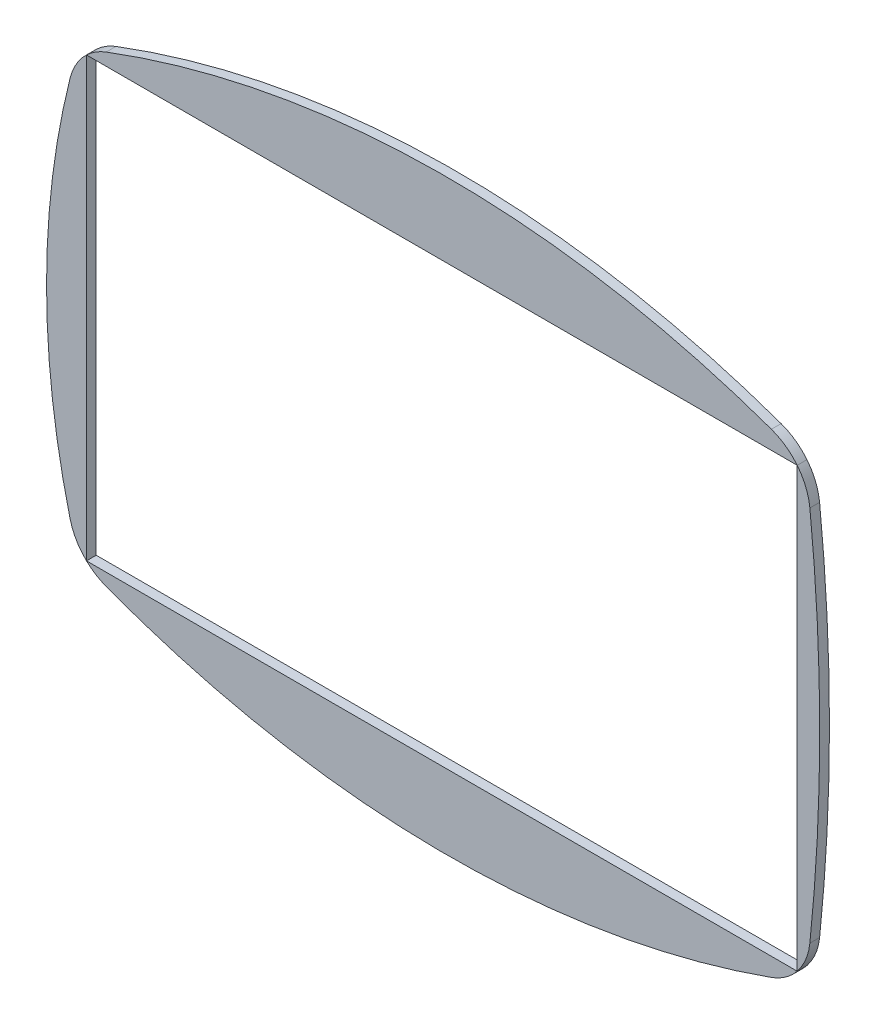
ISO-10303-21;
HEADER;
FILE_DESCRIPTION(('STEP AP214'),'2;1');
FILE_NAME('part.step','',(''),(''),'','','');
FILE_SCHEMA(('AUTOMOTIVE_DESIGN { 1 0 10303 214 1 1 1 1 }'));
ENDSEC;
DATA;
#1=APPLICATION_CONTEXT('core data for automotive mechanical design processes');
#2=APPLICATION_PROTOCOL_DEFINITION('international standard','automotive_design',2000,#1);
#3=PRODUCT_CONTEXT('',#1,'mechanical');
#4=PRODUCT('Part','Part','',(#3));
#5=PRODUCT_RELATED_PRODUCT_CATEGORY('part','',(#4));
#6=PRODUCT_DEFINITION_FORMATION('','',#4);
#7=PRODUCT_DEFINITION_CONTEXT('part definition',#1,'design');
#8=PRODUCT_DEFINITION('design','',#6,#7);
#9=PRODUCT_DEFINITION_SHAPE('','',#8);
#10=(LENGTH_UNIT() NAMED_UNIT(*) SI_UNIT(.MILLI.,.METRE.));
#11=(NAMED_UNIT(*) PLANE_ANGLE_UNIT() SI_UNIT($,.RADIAN.));
#12=(NAMED_UNIT(*) SI_UNIT($,.STERADIAN.) SOLID_ANGLE_UNIT());
#13=UNCERTAINTY_MEASURE_WITH_UNIT(LENGTH_MEASURE(1.E-05),#10,'distance_accuracy_value','');
#14=(GEOMETRIC_REPRESENTATION_CONTEXT(3) GLOBAL_UNCERTAINTY_ASSIGNED_CONTEXT((#13)) GLOBAL_UNIT_ASSIGNED_CONTEXT((#10,
#11,#12)) REPRESENTATION_CONTEXT('',''));
#15=CARTESIAN_POINT('',(0.,0.,0.));
#16=DIRECTION('',(0.,0.,1.));
#17=DIRECTION('',(1.,0.,0.));
#18=AXIS2_PLACEMENT_3D('',#15,#16,#17);
#19=CARTESIAN_POINT('',(-547.210393977895,62.5000000000001,-3.));
#20=DIRECTION('',(0.,0.,1.));
#21=DIRECTION('',(1.,0.,0.));
#22=AXIS2_PLACEMENT_3D('',#19,#20,#21);
#23=CYLINDRICAL_SURFACE('',#22,557.141534113717);
#24=CARTESIAN_POINT('',(-547.210393977895,62.5000000000001,0.));
#25=DIRECTION('',(0.,0.,1.));
#26=DIRECTION('',(1.,0.,0.));
#27=AXIS2_PLACEMENT_3D('',#24,#25,#26);
#28=CIRCLE('',#27,557.141534113717);
#29=CARTESIAN_POINT('',(6.89672289605585,4.43114376687543,0.));
#30=VERTEX_POINT('',#29);
#31=CARTESIAN_POINT('',(6.89672289605581,120.568856233125,0.));
#32=VERTEX_POINT('',#31);
#33=EDGE_CURVE('E110',#30,#32,#28,.T.);
#34=ORIENTED_EDGE('',*,*,#33,.F.);
#35=DIRECTION('',(0.,0.,1.));
#36=VECTOR('',#35,1.);
#37=CARTESIAN_POINT('',(6.89672289605585,4.43114376687543,-3.));
#38=LINE('',#37,#36);
#39=CARTESIAN_POINT('',(6.89672289605585,4.43114376687543,-3.));
#40=VERTEX_POINT('',#39);
#41=EDGE_CURVE('E12',#40,#30,#38,.T.);
#42=ORIENTED_EDGE('',*,*,#41,.F.);
#43=CARTESIAN_POINT('',(-547.210393977895,62.5000000000001,-3.));
#44=DIRECTION('',(0.,0.,1.));
#45=DIRECTION('',(1.,0.,0.));
#46=AXIS2_PLACEMENT_3D('',#43,#44,#45);
#47=CIRCLE('',#46,557.141534113717);
#48=CARTESIAN_POINT('',(6.89672289605581,120.568856233125,-3.));
#49=VERTEX_POINT('',#48);
#50=EDGE_CURVE('E104',#40,#49,#47,.T.);
#51=ORIENTED_EDGE('',*,*,#50,.T.);
#52=DIRECTION('',(0.,0.,1.));
#53=VECTOR('',#52,1.);
#54=CARTESIAN_POINT('',(6.89672289605581,120.568856233125,-3.));
#55=LINE('',#54,#53);
#56=EDGE_CURVE('E49',#49,#32,#55,.T.);
#57=ORIENTED_EDGE('',*,*,#56,.T.);
#58=EDGE_LOOP('',(#34,#42,#51,#57));
#59=FACE_BOUND('',#58,.T.);
#60=ADVANCED_FACE('F46',(#59),#23,.T.);
#61=CARTESIAN_POINT('',(-11.0052418526276,6.30721896177,-3.));
#62=DIRECTION('',(0.,0.,1.));
#63=DIRECTION('',(1.,0.,0.));
#64=AXIS2_PLACEMENT_3D('',#61,#62,#63);
#65=CYLINDRICAL_SURFACE('',#64,18.0000000000001);
#66=CARTESIAN_POINT('',(-11.0052418526276,6.30721896177,0.));
#67=DIRECTION('',(0.,0.,1.));
#68=DIRECTION('',(1.,0.,0.));
#69=AXIS2_PLACEMENT_3D('',#66,#67,#68);
#70=CIRCLE('',#69,18.0000000000001);
#71=CARTESIAN_POINT('',(2.99999999999996,-4.99999999999997,0.));
#72=VERTEX_POINT('',#71);
#73=EDGE_CURVE('E106',#72,#30,#70,.T.);
#74=ORIENTED_EDGE('',*,*,#73,.F.);
#75=DIRECTION('',(0.,0.,1.));
#76=VECTOR('',#75,1.);
#77=CARTESIAN_POINT('',(2.99999999999996,-4.99999999999997,-3.));
#78=LINE('',#77,#76);
#79=CARTESIAN_POINT('',(2.99999999999996,-4.99999999999997,-3.));
#80=VERTEX_POINT('',#79);
#81=EDGE_CURVE('E55',#80,#72,#78,.T.);
#82=ORIENTED_EDGE('',*,*,#81,.F.);
#83=CARTESIAN_POINT('',(-11.0052418526276,6.30721896177,-3.));
#84=DIRECTION('',(0.,0.,1.));
#85=DIRECTION('',(1.,0.,0.));
#86=AXIS2_PLACEMENT_3D('',#83,#84,#85);
#87=CIRCLE('',#86,18.0000000000001);
#88=EDGE_CURVE('E94',#80,#40,#87,.T.);
#89=ORIENTED_EDGE('',*,*,#88,.T.);
#90=ORIENTED_EDGE('',*,*,#41,.T.);
#91=EDGE_LOOP('',(#74,#82,#89,#90));
#92=FACE_BOUND('',#91,.T.);
#93=ADVANCED_FACE('F120',(#92),#65,.T.);
#94=CARTESIAN_POINT('',(2.99999999999996,0.,-3.));
#95=DIRECTION('',(1.,0.,0.));
#96=DIRECTION('',(0.,1.,0.));
#97=AXIS2_PLACEMENT_3D('',#94,#95,#96);
#98=PLANE('',#97);
#99=DIRECTION('',(0.,1.,0.));
#100=VECTOR('',#99,1.);
#101=CARTESIAN_POINT('',(2.99999999999996,0.,0.));
#102=LINE('',#101,#100);
#103=CARTESIAN_POINT('',(2.99999999999998,130.,0.));
#104=VERTEX_POINT('',#103);
#105=EDGE_CURVE('E99',#72,#104,#102,.T.);
#106=ORIENTED_EDGE('',*,*,#105,.T.);
#107=DIRECTION('',(0.,0.,1.));
#108=VECTOR('',#107,1.);
#109=CARTESIAN_POINT('',(2.99999999999998,130.,-3.));
#110=LINE('',#109,#108);
#111=CARTESIAN_POINT('',(2.99999999999998,130.,-3.));
#112=VERTEX_POINT('',#111);
#113=EDGE_CURVE('E97',#112,#104,#110,.T.);
#114=ORIENTED_EDGE('',*,*,#113,.F.);
#115=DIRECTION('',(0.,1.,0.));
#116=VECTOR('',#115,1.);
#117=CARTESIAN_POINT('',(2.99999999999996,0.,-3.));
#118=LINE('',#117,#116);
#119=EDGE_CURVE('E91',#80,#112,#118,.T.);
#120=ORIENTED_EDGE('',*,*,#119,.F.);
#121=ORIENTED_EDGE('',*,*,#81,.T.);
#122=EDGE_LOOP('',(#106,#114,#120,#121));
#123=FACE_BOUND('',#122,.T.);
#124=ADVANCED_FACE('F98',(#123),#98,.F.);
#125=CARTESIAN_POINT('',(-11.0052418526276,118.69278103823,-3.));
#126=DIRECTION('',(0.,0.,1.));
#127=DIRECTION('',(1.,0.,0.));
#128=AXIS2_PLACEMENT_3D('',#125,#126,#127);
#129=CYLINDRICAL_SURFACE('',#128,18.0000000000001);
#130=CARTESIAN_POINT('',(-11.0052418526276,118.69278103823,0.));
#131=DIRECTION('',(0.,0.,1.));
#132=DIRECTION('',(1.,0.,0.));
#133=AXIS2_PLACEMENT_3D('',#130,#131,#132);
#134=CIRCLE('',#133,18.0000000000001);
#135=EDGE_CURVE('E113',#104,#32,#134,.F.);
#136=ORIENTED_EDGE('',*,*,#135,.T.);
#137=ORIENTED_EDGE('',*,*,#56,.F.);
#138=CARTESIAN_POINT('',(-11.0052418526276,118.69278103823,-3.));
#139=DIRECTION('',(0.,0.,1.));
#140=DIRECTION('',(1.,0.,0.));
#141=AXIS2_PLACEMENT_3D('',#138,#139,#140);
#142=CIRCLE('',#141,18.0000000000001);
#143=EDGE_CURVE('E88',#112,#49,#142,.F.);
#144=ORIENTED_EDGE('',*,*,#143,.F.);
#145=ORIENTED_EDGE('',*,*,#113,.T.);
#146=EDGE_LOOP('',(#136,#137,#144,#145));
#147=FACE_BOUND('',#146,.T.);
#148=ADVANCED_FACE('F103',(#147),#129,.T.);
#149=CARTESIAN_POINT('',(0.,0.,-3.));
#150=DIRECTION('',(0.,0.,1.));
#151=DIRECTION('',(1.,0.,0.));
#152=AXIS2_PLACEMENT_3D('',#149,#150,#151);
#153=PLANE('',#152);
#154=ORIENTED_EDGE('',*,*,#50,.F.);
#155=ORIENTED_EDGE('',*,*,#88,.F.);
#156=ORIENTED_EDGE('',*,*,#119,.T.);
#157=ORIENTED_EDGE('',*,*,#143,.T.);
#158=EDGE_LOOP('',(#154,#155,#156,#157));
#159=FACE_BOUND('',#158,.T.);
#160=ADVANCED_FACE('F93',(#159),#153,.F.);
#161=CARTESIAN_POINT('',(0.,0.,0.));
#162=DIRECTION('',(0.,0.,1.));
#163=DIRECTION('',(1.,0.,0.));
#164=AXIS2_PLACEMENT_3D('',#161,#162,#163);
#165=PLANE('',#164);
#166=ORIENTED_EDGE('',*,*,#33,.T.);
#167=ORIENTED_EDGE('',*,*,#135,.F.);
#168=ORIENTED_EDGE('',*,*,#105,.F.);
#169=ORIENTED_EDGE('',*,*,#73,.T.);
#170=EDGE_LOOP('',(#166,#167,#168,#169));
#171=FACE_BOUND('',#170,.T.);
#172=ADVANCED_FACE('F119',(#171),#165,.T.);
#173=CLOSED_SHELL('',(#60,#93,#124,#148,#160,#172));
#174=MANIFOLD_SOLID_BREP('B2',#173);
#175=CARTESIAN_POINT('',(-104.95209396548,-144.556940420845,-3.));
#176=DIRECTION('',(0.,0.,1.));
#177=DIRECTION('',(1.,0.,0.));
#178=AXIS2_PLACEMENT_3D('',#175,#176,#177);
#179=CYLINDRICAL_SURFACE('',#178,297.511049638821);
#180=CARTESIAN_POINT('',(-104.95209396548,-144.556940420845,0.));
#181=DIRECTION('',(0.,0.,1.));
#182=DIRECTION('',(1.,0.,0.));
#183=AXIS2_PLACEMENT_3D('',#180,#181,#182);
#184=CIRCLE('',#183,297.511049638821);
#185=CARTESIAN_POINT('',(-4.9552365300597,135.64558126701,0.));
#186=VERTEX_POINT('',#185);
#187=CARTESIAN_POINT('',(-209.924844222303,133.819686401005,0.));
#188=VERTEX_POINT('',#187);
#189=EDGE_CURVE('E257',#186,#188,#184,.T.);
#190=ORIENTED_EDGE('',*,*,#189,.F.);
#191=DIRECTION('',(0.,0.,1.));
#192=VECTOR('',#191,1.);
#193=CARTESIAN_POINT('',(-4.9552365300597,135.64558126701,-3.));
#194=LINE('',#193,#192);
#195=CARTESIAN_POINT('',(-4.9552365300597,135.64558126701,-3.));
#196=VERTEX_POINT('',#195);
#197=EDGE_CURVE('E44',#196,#186,#194,.T.);
#198=ORIENTED_EDGE('',*,*,#197,.F.);
#199=CARTESIAN_POINT('',(-104.95209396548,-144.556940420845,-3.));
#200=DIRECTION('',(0.,0.,1.));
#201=DIRECTION('',(1.,0.,0.));
#202=AXIS2_PLACEMENT_3D('',#199,#200,#201);
#203=CIRCLE('',#202,297.511049638821);
#204=CARTESIAN_POINT('',(-209.924844222303,133.819686401005,-3.));
#205=VERTEX_POINT('',#204);
#206=EDGE_CURVE('E252',#196,#205,#203,.T.);
#207=ORIENTED_EDGE('',*,*,#206,.T.);
#208=DIRECTION('',(0.,0.,1.));
#209=VECTOR('',#208,1.);
#210=CARTESIAN_POINT('',(-209.924844222303,133.819686401005,-3.));
#211=LINE('',#210,#209);
#212=EDGE_CURVE('E195',#205,#188,#211,.T.);
#213=ORIENTED_EDGE('',*,*,#212,.T.);
#214=EDGE_LOOP('',(#190,#198,#207,#213));
#215=FACE_BOUND('',#214,.T.);
#216=ADVANCED_FACE('F192',(#215),#179,.T.);
#217=CARTESIAN_POINT('',(-11.0052418526276,118.69278103823,-3.));
#218=DIRECTION('',(0.,0.,1.));
#219=DIRECTION('',(1.,0.,0.));
#220=AXIS2_PLACEMENT_3D('',#217,#218,#219);
#221=CYLINDRICAL_SURFACE('',#220,18.0000000000001);
#222=CARTESIAN_POINT('',(-11.0052418526276,118.69278103823,0.));
#223=DIRECTION('',(0.,0.,1.));
#224=DIRECTION('',(1.,0.,0.));
#225=AXIS2_PLACEMENT_3D('',#222,#223,#224);
#226=CIRCLE('',#225,18.0000000000001);
#227=CARTESIAN_POINT('',(2.99999999999998,130.,0.));
#228=VERTEX_POINT('',#227);
#229=EDGE_CURVE('E225',#186,#228,#226,.F.);
#230=ORIENTED_EDGE('',*,*,#229,.T.);
#231=DIRECTION('',(0.,0.,1.));
#232=VECTOR('',#231,1.);
#233=CARTESIAN_POINT('',(2.99999999999998,130.,-3.));
#234=LINE('',#233,#232);
#235=CARTESIAN_POINT('',(2.99999999999998,130.,-3.));
#236=VERTEX_POINT('',#235);
#237=EDGE_CURVE('E201',#236,#228,#234,.T.);
#238=ORIENTED_EDGE('',*,*,#237,.F.);
#239=CARTESIAN_POINT('',(-11.0052418526276,118.69278103823,-3.));
#240=DIRECTION('',(0.,0.,1.));
#241=DIRECTION('',(1.,0.,0.));
#242=AXIS2_PLACEMENT_3D('',#239,#240,#241);
#243=CIRCLE('',#242,18.0000000000001);
#244=EDGE_CURVE('E242',#196,#236,#243,.F.);
#245=ORIENTED_EDGE('',*,*,#244,.F.);
#246=ORIENTED_EDGE('',*,*,#197,.T.);
#247=EDGE_LOOP('',(#230,#238,#245,#246));
#248=FACE_BOUND('',#247,.T.);
#249=ADVANCED_FACE('F267',(#248),#221,.T.);
#250=CARTESIAN_POINT('',(0.,130.,-3.));
#251=DIRECTION('',(0.,1.,0.));
#252=DIRECTION('',(0.,0.,1.));
#253=AXIS2_PLACEMENT_3D('',#250,#251,#252);
#254=PLANE('',#253);
#255=DIRECTION('',(-1.,0.,0.));
#256=VECTOR('',#255,1.);
#257=CARTESIAN_POINT('',(0.,130.,0.));
#258=LINE('',#257,#256);
#259=CARTESIAN_POINT('',(-216.,130.,0.));
#260=VERTEX_POINT('',#259);
#261=EDGE_CURVE('E249',#228,#260,#258,.T.);
#262=ORIENTED_EDGE('',*,*,#261,.T.);
#263=DIRECTION('',(0.,0.,1.));
#264=VECTOR('',#263,1.);
#265=CARTESIAN_POINT('',(-216.,130.,-3.));
#266=LINE('',#265,#264);
#267=CARTESIAN_POINT('',(-216.,130.,-3.));
#268=VERTEX_POINT('',#267);
#269=EDGE_CURVE('E246',#268,#260,#266,.T.);
#270=ORIENTED_EDGE('',*,*,#269,.F.);
#271=DIRECTION('',(-1.,0.,0.));
#272=VECTOR('',#271,1.);
#273=CARTESIAN_POINT('',(0.,130.,-3.));
#274=LINE('',#273,#272);
#275=EDGE_CURVE('E237',#236,#268,#274,.T.);
#276=ORIENTED_EDGE('',*,*,#275,.F.);
#277=ORIENTED_EDGE('',*,*,#237,.T.);
#278=EDGE_LOOP('',(#262,#270,#276,#277));
#279=FACE_BOUND('',#278,.T.);
#280=ADVANCED_FACE('F247',(#279),#254,.F.);
#281=CARTESIAN_POINT('',(-203.573787658466,116.9773563804,-3.));
#282=DIRECTION('',(0.,0.,1.));
#283=DIRECTION('',(1.,0.,0.));
#284=AXIS2_PLACEMENT_3D('',#281,#282,#283);
#285=CYLINDRICAL_SURFACE('',#284,18.0000000000002);
#286=CARTESIAN_POINT('',(-203.573787658466,116.9773563804,0.));
#287=DIRECTION('',(0.,0.,1.));
#288=DIRECTION('',(1.,0.,0.));
#289=AXIS2_PLACEMENT_3D('',#286,#287,#288);
#290=CIRCLE('',#289,18.0000000000002);
#291=EDGE_CURVE('E260',#188,#260,#290,.T.);
#292=ORIENTED_EDGE('',*,*,#291,.F.);
#293=ORIENTED_EDGE('',*,*,#212,.F.);
#294=CARTESIAN_POINT('',(-203.573787658466,116.9773563804,-3.));
#295=DIRECTION('',(0.,0.,1.));
#296=DIRECTION('',(1.,0.,0.));
#297=AXIS2_PLACEMENT_3D('',#294,#295,#296);
#298=CIRCLE('',#297,18.0000000000002);
#299=EDGE_CURVE('E241',#205,#268,#298,.T.);
#300=ORIENTED_EDGE('',*,*,#299,.T.);
#301=ORIENTED_EDGE('',*,*,#269,.T.);
#302=EDGE_LOOP('',(#292,#293,#300,#301));
#303=FACE_BOUND('',#302,.T.);
#304=ADVANCED_FACE('F251',(#303),#285,.T.);
#305=CARTESIAN_POINT('',(0.,0.,-3.));
#306=DIRECTION('',(0.,0.,1.));
#307=DIRECTION('',(1.,0.,0.));
#308=AXIS2_PLACEMENT_3D('',#305,#306,#307);
#309=PLANE('',#308);
#310=ORIENTED_EDGE('',*,*,#206,.F.);
#311=ORIENTED_EDGE('',*,*,#244,.T.);
#312=ORIENTED_EDGE('',*,*,#275,.T.);
#313=ORIENTED_EDGE('',*,*,#299,.F.);
#314=EDGE_LOOP('',(#310,#311,#312,#313));
#315=FACE_BOUND('',#314,.T.);
#316=ADVANCED_FACE('F240',(#315),#309,.F.);
#317=CARTESIAN_POINT('',(0.,0.,0.));
#318=DIRECTION('',(0.,0.,1.));
#319=DIRECTION('',(1.,0.,0.));
#320=AXIS2_PLACEMENT_3D('',#317,#318,#319);
#321=PLANE('',#320);
#322=ORIENTED_EDGE('',*,*,#189,.T.);
#323=ORIENTED_EDGE('',*,*,#291,.T.);
#324=ORIENTED_EDGE('',*,*,#261,.F.);
#325=ORIENTED_EDGE('',*,*,#229,.F.);
#326=EDGE_LOOP('',(#322,#323,#324,#325));
#327=FACE_BOUND('',#326,.T.);
#328=ADVANCED_FACE('F265',(#327),#321,.T.);
#329=CLOSED_SHELL('',(#216,#249,#280,#304,#316,#328));
#330=MANIFOLD_SOLID_BREP('B6',#329);
#331=CARTESIAN_POINT('',(-203.573787658466,8.0226436195998,-3.));
#332=DIRECTION('',(0.,0.,1.));
#333=DIRECTION('',(1.,0.,0.));
#334=AXIS2_PLACEMENT_3D('',#331,#332,#333);
#335=CYLINDRICAL_SURFACE('',#334,18.0000000000002);
#336=CARTESIAN_POINT('',(-203.573787658466,8.0226436195998,0.));
#337=DIRECTION('',(0.,0.,1.));
#338=DIRECTION('',(1.,0.,0.));
#339=AXIS2_PLACEMENT_3D('',#336,#337,#338);
#340=CIRCLE('',#339,18.0000000000002);
#341=CARTESIAN_POINT('',(-209.924844222303,-8.81968640100444,0.));
#342=VERTEX_POINT('',#341);
#343=CARTESIAN_POINT('',(-216.,-4.99999999999997,0.));
#344=VERTEX_POINT('',#343);
#345=EDGE_CURVE('E395',#342,#344,#340,.F.);
#346=ORIENTED_EDGE('',*,*,#345,.T.);
#347=DIRECTION('',(0.,0.,1.));
#348=VECTOR('',#347,1.);
#349=CARTESIAN_POINT('',(-216.,-4.99999999999997,-3.));
#350=LINE('',#349,#348);
#351=CARTESIAN_POINT('',(-216.,-4.99999999999997,-3.));
#352=VERTEX_POINT('',#351);
#353=EDGE_CURVE('E190',#352,#344,#350,.T.);
#354=ORIENTED_EDGE('',*,*,#353,.F.);
#355=CARTESIAN_POINT('',(-203.573787658466,8.0226436195998,-3.));
#356=DIRECTION('',(0.,0.,1.));
#357=DIRECTION('',(1.,0.,0.));
#358=AXIS2_PLACEMENT_3D('',#355,#356,#357);
#359=CIRCLE('',#358,18.0000000000002);
#360=CARTESIAN_POINT('',(-209.924844222303,-8.81968640100444,-3.));
#361=VERTEX_POINT('',#360);
#362=EDGE_CURVE('E388',#361,#352,#359,.F.);
#363=ORIENTED_EDGE('',*,*,#362,.F.);
#364=DIRECTION('',(0.,0.,1.));
#365=VECTOR('',#364,1.);
#366=CARTESIAN_POINT('',(-209.924844222303,-8.81968640100444,-3.));
#367=LINE('',#366,#365);
#368=EDGE_CURVE('E334',#361,#342,#367,.T.);
#369=ORIENTED_EDGE('',*,*,#368,.T.);
#370=EDGE_LOOP('',(#346,#354,#363,#369));
#371=FACE_BOUND('',#370,.T.);
#372=ADVANCED_FACE('F331',(#371),#335,.T.);
#373=CARTESIAN_POINT('',(0.,-4.99999999999997,-3.));
#374=DIRECTION('',(0.,-1.,0.));
#375=DIRECTION('',(0.,0.,-1.));
#376=AXIS2_PLACEMENT_3D('',#373,#374,#375);
#377=PLANE('',#376);
#378=DIRECTION('',(1.,0.,0.));
#379=VECTOR('',#378,1.);
#380=CARTESIAN_POINT('',(0.,-4.99999999999997,0.));
#381=LINE('',#380,#379);
#382=CARTESIAN_POINT('',(2.99999999999996,-4.99999999999997,0.));
#383=VERTEX_POINT('',#382);
#384=EDGE_CURVE('E370',#344,#383,#381,.T.);
#385=ORIENTED_EDGE('',*,*,#384,.T.);
#386=DIRECTION('',(0.,0.,1.));
#387=VECTOR('',#386,1.);
#388=CARTESIAN_POINT('',(2.99999999999996,-4.99999999999997,-3.));
#389=LINE('',#388,#387);
#390=CARTESIAN_POINT('',(2.99999999999996,-4.99999999999997,-3.));
#391=VERTEX_POINT('',#390);
#392=EDGE_CURVE('E340',#391,#383,#389,.T.);
#393=ORIENTED_EDGE('',*,*,#392,.F.);
#394=DIRECTION('',(1.,0.,0.));
#395=VECTOR('',#394,1.);
#396=CARTESIAN_POINT('',(0.,-4.99999999999997,-3.));
#397=LINE('',#396,#395);
#398=EDGE_CURVE('E348',#352,#391,#397,.T.);
#399=ORIENTED_EDGE('',*,*,#398,.F.);
#400=ORIENTED_EDGE('',*,*,#353,.T.);
#401=EDGE_LOOP('',(#385,#393,#399,#400));
#402=FACE_BOUND('',#401,.T.);
#403=ADVANCED_FACE('F404',(#402),#377,.F.);
#404=CARTESIAN_POINT('',(-11.0052418526276,6.30721896177,-3.));
#405=DIRECTION('',(0.,0.,1.));
#406=DIRECTION('',(1.,0.,0.));
#407=AXIS2_PLACEMENT_3D('',#404,#405,#406);
#408=CYLINDRICAL_SURFACE('',#407,18.0000000000001);
#409=CARTESIAN_POINT('',(-11.0052418526276,6.30721896177,0.));
#410=DIRECTION('',(0.,0.,1.));
#411=DIRECTION('',(1.,0.,0.));
#412=AXIS2_PLACEMENT_3D('',#409,#410,#411);
#413=CIRCLE('',#412,18.0000000000001);
#414=CARTESIAN_POINT('',(-4.95523653005969,-10.6455812670094,0.));
#415=VERTEX_POINT('',#414);
#416=EDGE_CURVE('E382',#415,#383,#413,.T.);
#417=ORIENTED_EDGE('',*,*,#416,.F.);
#418=DIRECTION('',(0.,0.,1.));
#419=VECTOR('',#418,1.);
#420=CARTESIAN_POINT('',(-4.95523653005969,-10.6455812670094,-3.));
#421=LINE('',#420,#419);
#422=CARTESIAN_POINT('',(-4.95523653005969,-10.6455812670094,-3.));
#423=VERTEX_POINT('',#422);
#424=EDGE_CURVE('E379',#423,#415,#421,.T.);
#425=ORIENTED_EDGE('',*,*,#424,.F.);
#426=CARTESIAN_POINT('',(-11.0052418526276,6.30721896177,-3.));
#427=DIRECTION('',(0.,0.,1.));
#428=DIRECTION('',(1.,0.,0.));
#429=AXIS2_PLACEMENT_3D('',#426,#427,#428);
#430=CIRCLE('',#429,18.0000000000001);
#431=EDGE_CURVE('E381',#423,#391,#430,.T.);
#432=ORIENTED_EDGE('',*,*,#431,.T.);
#433=ORIENTED_EDGE('',*,*,#392,.T.);
#434=EDGE_LOOP('',(#417,#425,#432,#433));
#435=FACE_BOUND('',#434,.T.);
#436=ADVANCED_FACE('F380',(#435),#408,.T.);
#437=CARTESIAN_POINT('',(-104.95209396548,269.556940420845,-3.));
#438=DIRECTION('',(0.,0.,1.));
#439=DIRECTION('',(1.,0.,0.));
#440=AXIS2_PLACEMENT_3D('',#437,#438,#439);
#441=CYLINDRICAL_SURFACE('',#440,297.511049638821);
#442=CARTESIAN_POINT('',(-104.95209396548,269.556940420845,0.));
#443=DIRECTION('',(0.,0.,1.));
#444=DIRECTION('',(1.,0.,0.));
#445=AXIS2_PLACEMENT_3D('',#442,#443,#444);
#446=CIRCLE('',#445,297.511049638821);
#447=EDGE_CURVE('E398',#415,#342,#446,.F.);
#448=ORIENTED_EDGE('',*,*,#447,.T.);
#449=ORIENTED_EDGE('',*,*,#368,.F.);
#450=CARTESIAN_POINT('',(-104.95209396548,269.556940420845,-3.));
#451=DIRECTION('',(0.,0.,1.));
#452=DIRECTION('',(1.,0.,0.));
#453=AXIS2_PLACEMENT_3D('',#450,#451,#452);
#454=CIRCLE('',#453,297.511049638821);
#455=EDGE_CURVE('E376',#423,#361,#454,.F.);
#456=ORIENTED_EDGE('',*,*,#455,.F.);
#457=ORIENTED_EDGE('',*,*,#424,.T.);
#458=EDGE_LOOP('',(#448,#449,#456,#457));
#459=FACE_BOUND('',#458,.T.);
#460=ADVANCED_FACE('F385',(#459),#441,.T.);
#461=CARTESIAN_POINT('',(0.,0.,-3.));
#462=DIRECTION('',(0.,0.,1.));
#463=DIRECTION('',(1.,0.,0.));
#464=AXIS2_PLACEMENT_3D('',#461,#462,#463);
#465=PLANE('',#464);
#466=ORIENTED_EDGE('',*,*,#362,.T.);
#467=ORIENTED_EDGE('',*,*,#398,.T.);
#468=ORIENTED_EDGE('',*,*,#431,.F.);
#469=ORIENTED_EDGE('',*,*,#455,.T.);
#470=EDGE_LOOP('',(#466,#467,#468,#469));
#471=FACE_BOUND('',#470,.T.);
#472=ADVANCED_FACE('F390',(#471),#465,.F.);
#473=CARTESIAN_POINT('',(0.,0.,0.));
#474=DIRECTION('',(0.,0.,1.));
#475=DIRECTION('',(1.,0.,0.));
#476=AXIS2_PLACEMENT_3D('',#473,#474,#475);
#477=PLANE('',#476);
#478=ORIENTED_EDGE('',*,*,#345,.F.);
#479=ORIENTED_EDGE('',*,*,#447,.F.);
#480=ORIENTED_EDGE('',*,*,#416,.T.);
#481=ORIENTED_EDGE('',*,*,#384,.F.);
#482=EDGE_LOOP('',(#478,#479,#480,#481));
#483=FACE_BOUND('',#482,.T.);
#484=ADVANCED_FACE('F413',(#483),#477,.T.);
#485=CLOSED_SHELL('',(#372,#403,#436,#460,#472,#484));
#486=MANIFOLD_SOLID_BREP('B38',#485);
#487=CARTESIAN_POINT('',(-216.,0.,-3.));
#488=DIRECTION('',(1.,0.,0.));
#489=DIRECTION('',(0.,0.,-1.));
#490=AXIS2_PLACEMENT_3D('',#487,#488,#489);
#491=PLANE('',#490);
#492=DIRECTION('',(0.,1.,0.));
#493=VECTOR('',#492,1.);
#494=CARTESIAN_POINT('',(-216.,0.,0.));
#495=LINE('',#494,#493);
#496=CARTESIAN_POINT('',(-216.,-4.99999999999997,0.));
#497=VERTEX_POINT('',#496);
#498=CARTESIAN_POINT('',(-216.,130.,0.));
#499=VERTEX_POINT('',#498);
#500=EDGE_CURVE('E529',#497,#499,#495,.T.);
#501=ORIENTED_EDGE('',*,*,#500,.F.);
#502=DIRECTION('',(0.,0.,1.));
#503=VECTOR('',#502,1.);
#504=CARTESIAN_POINT('',(-216.,-4.99999999999997,-3.));
#505=LINE('',#504,#503);
#506=CARTESIAN_POINT('',(-216.,-4.99999999999997,-3.));
#507=VERTEX_POINT('',#506);
#508=EDGE_CURVE('E329',#507,#497,#505,.T.);
#509=ORIENTED_EDGE('',*,*,#508,.F.);
#510=DIRECTION('',(0.,1.,0.));
#511=VECTOR('',#510,1.);
#512=CARTESIAN_POINT('',(-216.,0.,-3.));
#513=LINE('',#512,#511);
#514=CARTESIAN_POINT('',(-216.,130.,-3.));
#515=VERTEX_POINT('',#514);
#516=EDGE_CURVE('E524',#507,#515,#513,.T.);
#517=ORIENTED_EDGE('',*,*,#516,.T.);
#518=DIRECTION('',(0.,0.,1.));
#519=VECTOR('',#518,1.);
#520=CARTESIAN_POINT('',(-216.,130.,-3.));
#521=LINE('',#520,#519);
#522=EDGE_CURVE('E467',#515,#499,#521,.T.);
#523=ORIENTED_EDGE('',*,*,#522,.T.);
#524=EDGE_LOOP('',(#501,#509,#517,#523));
#525=FACE_BOUND('',#524,.T.);
#526=ADVANCED_FACE('F464',(#525),#491,.T.);
#527=CARTESIAN_POINT('',(-203.573787658466,8.0226436195998,-3.));
#528=DIRECTION('',(0.,0.,1.));
#529=DIRECTION('',(1.,0.,0.));
#530=AXIS2_PLACEMENT_3D('',#527,#528,#529);
#531=CYLINDRICAL_SURFACE('',#530,18.0000000000002);
#532=CARTESIAN_POINT('',(-203.573787658466,8.0226436195998,0.));
#533=DIRECTION('',(0.,0.,1.));
#534=DIRECTION('',(1.,0.,0.));
#535=AXIS2_PLACEMENT_3D('',#532,#533,#534);
#536=CIRCLE('',#535,18.0000000000002);
#537=CARTESIAN_POINT('',(-221.032182673614,3.64035614670738,0.));
#538=VERTEX_POINT('',#537);
#539=EDGE_CURVE('E497',#497,#538,#536,.F.);
#540=ORIENTED_EDGE('',*,*,#539,.T.);
#541=DIRECTION('',(0.,0.,1.));
#542=VECTOR('',#541,1.);
#543=CARTESIAN_POINT('',(-221.032182673614,3.64035614670738,-3.));
#544=LINE('',#543,#542);
#545=CARTESIAN_POINT('',(-221.032182673614,3.64035614670738,-3.));
#546=VERTEX_POINT('',#545);
#547=EDGE_CURVE('E473',#546,#538,#544,.T.);
#548=ORIENTED_EDGE('',*,*,#547,.F.);
#549=CARTESIAN_POINT('',(-203.573787658466,8.0226436195998,-3.));
#550=DIRECTION('',(0.,0.,1.));
#551=DIRECTION('',(1.,0.,0.));
#552=AXIS2_PLACEMENT_3D('',#549,#550,#551);
#553=CIRCLE('',#552,18.0000000000002);
#554=EDGE_CURVE('E514',#507,#546,#553,.F.);
#555=ORIENTED_EDGE('',*,*,#554,.F.);
#556=ORIENTED_EDGE('',*,*,#508,.T.);
#557=EDGE_LOOP('',(#540,#548,#555,#556));
#558=FACE_BOUND('',#557,.T.);
#559=ADVANCED_FACE('F539',(#558),#531,.T.);
#560=CARTESIAN_POINT('',(13.4560655753004,62.5000000000001,-3.));
#561=DIRECTION('',(0.,0.,1.));
#562=DIRECTION('',(1.,0.,0.));
#563=AXIS2_PLACEMENT_3D('',#560,#561,#562);
#564=CYLINDRICAL_SURFACE('',#563,241.76268579204);
#565=CARTESIAN_POINT('',(13.4560655753004,62.5000000000001,0.));
#566=DIRECTION('',(0.,0.,1.));
#567=DIRECTION('',(1.,0.,0.));
#568=AXIS2_PLACEMENT_3D('',#565,#566,#567);
#569=CIRCLE('',#568,241.76268579204);
#570=CARTESIAN_POINT('',(-221.032182673613,121.359643853293,0.));
#571=VERTEX_POINT('',#570);
#572=EDGE_CURVE('E521',#538,#571,#569,.F.);
#573=ORIENTED_EDGE('',*,*,#572,.T.);
#574=DIRECTION('',(0.,0.,1.));
#575=VECTOR('',#574,1.);
#576=CARTESIAN_POINT('',(-221.032182673613,121.359643853293,-3.));
#577=LINE('',#576,#575);
#578=CARTESIAN_POINT('',(-221.032182673613,121.359643853293,-3.));
#579=VERTEX_POINT('',#578);
#580=EDGE_CURVE('E518',#579,#571,#577,.T.);
#581=ORIENTED_EDGE('',*,*,#580,.F.);
#582=CARTESIAN_POINT('',(13.4560655753004,62.5000000000001,-3.));
#583=DIRECTION('',(0.,0.,1.));
#584=DIRECTION('',(1.,0.,0.));
#585=AXIS2_PLACEMENT_3D('',#582,#583,#584);
#586=CIRCLE('',#585,241.76268579204);
#587=EDGE_CURVE('E509',#546,#579,#586,.F.);
#588=ORIENTED_EDGE('',*,*,#587,.F.);
#589=ORIENTED_EDGE('',*,*,#547,.T.);
#590=EDGE_LOOP('',(#573,#581,#588,#589));
#591=FACE_BOUND('',#590,.T.);
#592=ADVANCED_FACE('F519',(#591),#564,.T.);
#593=CARTESIAN_POINT('',(-203.573787658466,116.9773563804,-3.));
#594=DIRECTION('',(0.,0.,1.));
#595=DIRECTION('',(1.,0.,0.));
#596=AXIS2_PLACEMENT_3D('',#593,#594,#595);
#597=CYLINDRICAL_SURFACE('',#596,18.0000000000002);
#598=CARTESIAN_POINT('',(-203.573787658466,116.9773563804,0.));
#599=DIRECTION('',(0.,0.,1.));
#600=DIRECTION('',(1.,0.,0.));
#601=AXIS2_PLACEMENT_3D('',#598,#599,#600);
#602=CIRCLE('',#601,18.0000000000002);
#603=EDGE_CURVE('E532',#499,#571,#602,.T.);
#604=ORIENTED_EDGE('',*,*,#603,.F.);
#605=ORIENTED_EDGE('',*,*,#522,.F.);
#606=CARTESIAN_POINT('',(-203.573787658466,116.9773563804,-3.));
#607=DIRECTION('',(0.,0.,1.));
#608=DIRECTION('',(1.,0.,0.));
#609=AXIS2_PLACEMENT_3D('',#606,#607,#608);
#610=CIRCLE('',#609,18.0000000000002);
#611=EDGE_CURVE('E513',#515,#579,#610,.T.);
#612=ORIENTED_EDGE('',*,*,#611,.T.);
#613=ORIENTED_EDGE('',*,*,#580,.T.);
#614=EDGE_LOOP('',(#604,#605,#612,#613));
#615=FACE_BOUND('',#614,.T.);
#616=ADVANCED_FACE('F523',(#615),#597,.T.);
#617=CARTESIAN_POINT('',(0.,0.,-3.));
#618=DIRECTION('',(0.,0.,1.));
#619=DIRECTION('',(1.,0.,0.));
#620=AXIS2_PLACEMENT_3D('',#617,#618,#619);
#621=PLANE('',#620);
#622=ORIENTED_EDGE('',*,*,#516,.F.);
#623=ORIENTED_EDGE('',*,*,#554,.T.);
#624=ORIENTED_EDGE('',*,*,#587,.T.);
#625=ORIENTED_EDGE('',*,*,#611,.F.);
#626=EDGE_LOOP('',(#622,#623,#624,#625));
#627=FACE_BOUND('',#626,.T.);
#628=ADVANCED_FACE('F512',(#627),#621,.F.);
#629=CARTESIAN_POINT('',(0.,0.,0.));
#630=DIRECTION('',(0.,0.,1.));
#631=DIRECTION('',(1.,0.,0.));
#632=AXIS2_PLACEMENT_3D('',#629,#630,#631);
#633=PLANE('',#632);
#634=ORIENTED_EDGE('',*,*,#500,.T.);
#635=ORIENTED_EDGE('',*,*,#603,.T.);
#636=ORIENTED_EDGE('',*,*,#572,.F.);
#637=ORIENTED_EDGE('',*,*,#539,.F.);
#638=EDGE_LOOP('',(#634,#635,#636,#637));
#639=FACE_BOUND('',#638,.T.);
#640=ADVANCED_FACE('F537',(#639),#633,.T.);
#641=CLOSED_SHELL('',(#526,#559,#592,#616,#628,#640));
#642=MANIFOLD_SOLID_BREP('B184',#641);
#643=ADVANCED_BREP_SHAPE_REPRESENTATION('',(#18,#174,#330,#486,#642),#14);
#644=SHAPE_DEFINITION_REPRESENTATION(#9,#643);
ENDSEC;
END-ISO-10303-21;
